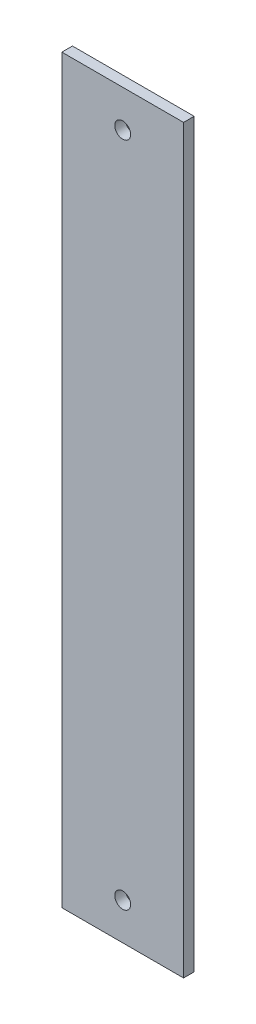
ISO-10303-21;
HEADER;
FILE_DESCRIPTION(('STEP AP214'),'2;1');
FILE_NAME('part.step','',(''),(''),'','','');
FILE_SCHEMA(('AUTOMOTIVE_DESIGN { 1 0 10303 214 1 1 1 1 }'));
ENDSEC;
DATA;
#1=APPLICATION_CONTEXT('core data for automotive mechanical design processes');
#2=APPLICATION_PROTOCOL_DEFINITION('international standard','automotive_design',2000,#1);
#3=PRODUCT_CONTEXT('',#1,'mechanical');
#4=PRODUCT('Part','Part','',(#3));
#5=PRODUCT_RELATED_PRODUCT_CATEGORY('part','',(#4));
#6=PRODUCT_DEFINITION_FORMATION('','',#4);
#7=PRODUCT_DEFINITION_CONTEXT('part definition',#1,'design');
#8=PRODUCT_DEFINITION('design','',#6,#7);
#9=PRODUCT_DEFINITION_SHAPE('','',#8);
#10=(LENGTH_UNIT() NAMED_UNIT(*) SI_UNIT(.MILLI.,.METRE.));
#11=(NAMED_UNIT(*) PLANE_ANGLE_UNIT() SI_UNIT($,.RADIAN.));
#12=(NAMED_UNIT(*) SI_UNIT($,.STERADIAN.) SOLID_ANGLE_UNIT());
#13=UNCERTAINTY_MEASURE_WITH_UNIT(LENGTH_MEASURE(1.E-05),#10,'distance_accuracy_value','');
#14=(GEOMETRIC_REPRESENTATION_CONTEXT(3) GLOBAL_UNCERTAINTY_ASSIGNED_CONTEXT((#13)) GLOBAL_UNIT_ASSIGNED_CONTEXT((#10,
#11,#12)) REPRESENTATION_CONTEXT('',''));
#15=CARTESIAN_POINT('',(0.,0.,0.));
#16=DIRECTION('',(0.,0.,1.));
#17=DIRECTION('',(1.,0.,0.));
#18=AXIS2_PLACEMENT_3D('',#15,#16,#17);
#19=CARTESIAN_POINT('',(0.,0.,2.));
#20=DIRECTION('',(0.,0.,-1.));
#21=DIRECTION('',(-1.,0.,0.));
#22=AXIS2_PLACEMENT_3D('',#19,#20,#21);
#23=PLANE('',#22);
#24=DIRECTION('',(0.,-1.,0.));
#25=VECTOR('',#24,1.);
#26=CARTESIAN_POINT('',(0.,0.,2.));
#27=LINE('',#26,#25);
#28=CARTESIAN_POINT('',(0.,140.,2.));
#29=VERTEX_POINT('',#28);
#30=CARTESIAN_POINT('',(0.,0.,2.));
#31=VERTEX_POINT('',#30);
#32=EDGE_CURVE('E85',#29,#31,#27,.T.);
#33=ORIENTED_EDGE('',*,*,#32,.T.);
#34=DIRECTION('',(1.,0.,0.));
#35=VECTOR('',#34,1.);
#36=CARTESIAN_POINT('',(0.,0.,2.));
#37=LINE('',#36,#35);
#38=CARTESIAN_POINT('',(23.,0.,2.));
#39=VERTEX_POINT('',#38);
#40=EDGE_CURVE('E80',#31,#39,#37,.T.);
#41=ORIENTED_EDGE('',*,*,#40,.T.);
#42=DIRECTION('',(0.,1.,0.));
#43=VECTOR('',#42,1.);
#44=CARTESIAN_POINT('',(23.,0.,2.));
#45=LINE('',#44,#43);
#46=CARTESIAN_POINT('',(23.,140.,2.));
#47=VERTEX_POINT('',#46);
#48=EDGE_CURVE('E83',#39,#47,#45,.T.);
#49=ORIENTED_EDGE('',*,*,#48,.T.);
#50=DIRECTION('',(-1.,0.,0.));
#51=VECTOR('',#50,1.);
#52=CARTESIAN_POINT('',(0.,140.,2.));
#53=LINE('',#52,#51);
#54=EDGE_CURVE('E50',#47,#29,#53,.T.);
#55=ORIENTED_EDGE('',*,*,#54,.T.);
#56=EDGE_LOOP('',(#33,#41,#49,#55));
#57=FACE_BOUND('',#56,.T.);
#58=CARTESIAN_POINT('',(11.5,133.,2.));
#59=DIRECTION('',(0.,0.,1.));
#60=DIRECTION('',(1.,0.,0.));
#61=AXIS2_PLACEMENT_3D('',#58,#59,#60);
#62=CIRCLE('',#61,1.5);
#63=CARTESIAN_POINT('',(13.,133.,2.));
#64=VERTEX_POINT('',#63);
#65=EDGE_CURVE('E100',#64,#64,#62,.T.);
#66=ORIENTED_EDGE('',*,*,#65,.F.);
#67=EDGE_LOOP('',(#66));
#68=FACE_BOUND('',#67,.T.);
#69=CARTESIAN_POINT('',(11.5,7.,2.));
#70=DIRECTION('',(0.,0.,1.));
#71=DIRECTION('',(1.,0.,0.));
#72=AXIS2_PLACEMENT_3D('',#69,#70,#71);
#73=CIRCLE('',#72,1.5);
#74=CARTESIAN_POINT('',(13.,7.,2.));
#75=VERTEX_POINT('',#74);
#76=EDGE_CURVE('E115',#75,#75,#73,.T.);
#77=ORIENTED_EDGE('',*,*,#76,.F.);
#78=EDGE_LOOP('',(#77));
#79=FACE_BOUND('',#78,.T.);
#80=ADVANCED_FACE('F33',(#57,#68,#79),#23,.F.);
#81=CARTESIAN_POINT('',(0.,0.,0.));
#82=DIRECTION('',(0.,0.,-1.));
#83=DIRECTION('',(-1.,0.,0.));
#84=AXIS2_PLACEMENT_3D('',#81,#82,#83);
#85=PLANE('',#84);
#86=CARTESIAN_POINT('',(11.5,133.,0.));
#87=DIRECTION('',(0.,0.,1.));
#88=DIRECTION('',(1.,0.,0.));
#89=AXIS2_PLACEMENT_3D('',#86,#87,#88);
#90=CIRCLE('',#89,1.5);
#91=CARTESIAN_POINT('',(13.,133.,0.));
#92=VERTEX_POINT('',#91);
#93=EDGE_CURVE('E112',#92,#92,#90,.T.);
#94=ORIENTED_EDGE('',*,*,#93,.T.);
#95=EDGE_LOOP('',(#94));
#96=FACE_BOUND('',#95,.T.);
#97=DIRECTION('',(0.,-1.,0.));
#98=VECTOR('',#97,1.);
#99=CARTESIAN_POINT('',(0.,0.,0.));
#100=LINE('',#99,#98);
#101=CARTESIAN_POINT('',(0.,140.,0.));
#102=VERTEX_POINT('',#101);
#103=CARTESIAN_POINT('',(0.,0.,0.));
#104=VERTEX_POINT('',#103);
#105=EDGE_CURVE('E97',#102,#104,#100,.T.);
#106=ORIENTED_EDGE('',*,*,#105,.F.);
#107=DIRECTION('',(-1.,0.,0.));
#108=VECTOR('',#107,1.);
#109=CARTESIAN_POINT('',(0.,140.,0.));
#110=LINE('',#109,#108);
#111=CARTESIAN_POINT('',(23.,140.,0.));
#112=VERTEX_POINT('',#111);
#113=EDGE_CURVE('E73',#112,#102,#110,.T.);
#114=ORIENTED_EDGE('',*,*,#113,.F.);
#115=DIRECTION('',(0.,1.,0.));
#116=VECTOR('',#115,1.);
#117=CARTESIAN_POINT('',(23.,0.,0.));
#118=LINE('',#117,#116);
#119=CARTESIAN_POINT('',(23.,0.,0.));
#120=VERTEX_POINT('',#119);
#121=EDGE_CURVE('E67',#120,#112,#118,.T.);
#122=ORIENTED_EDGE('',*,*,#121,.F.);
#123=DIRECTION('',(1.,0.,0.));
#124=VECTOR('',#123,1.);
#125=CARTESIAN_POINT('',(0.,0.,0.));
#126=LINE('',#125,#124);
#127=EDGE_CURVE('E89',#104,#120,#126,.T.);
#128=ORIENTED_EDGE('',*,*,#127,.F.);
#129=EDGE_LOOP('',(#106,#114,#122,#128));
#130=FACE_BOUND('',#129,.T.);
#131=CARTESIAN_POINT('',(11.5,7.,0.));
#132=DIRECTION('',(0.,0.,1.));
#133=DIRECTION('',(1.,0.,0.));
#134=AXIS2_PLACEMENT_3D('',#131,#132,#133);
#135=CIRCLE('',#134,1.5);
#136=CARTESIAN_POINT('',(13.,7.,0.));
#137=VERTEX_POINT('',#136);
#138=EDGE_CURVE('E118',#137,#137,#135,.T.);
#139=ORIENTED_EDGE('',*,*,#138,.T.);
#140=EDGE_LOOP('',(#139));
#141=FACE_BOUND('',#140,.T.);
#142=ADVANCED_FACE('F108',(#96,#130,#141),#85,.T.);
#143=CARTESIAN_POINT('',(0.,0.,2.));
#144=DIRECTION('',(1.,0.,0.));
#145=DIRECTION('',(0.,0.,-1.));
#146=AXIS2_PLACEMENT_3D('',#143,#144,#145);
#147=PLANE('',#146);
#148=ORIENTED_EDGE('',*,*,#105,.T.);
#149=DIRECTION('',(0.,0.,-1.));
#150=VECTOR('',#149,1.);
#151=CARTESIAN_POINT('',(0.,0.,2.));
#152=LINE('',#151,#150);
#153=EDGE_CURVE('E11',#31,#104,#152,.T.);
#154=ORIENTED_EDGE('',*,*,#153,.F.);
#155=ORIENTED_EDGE('',*,*,#32,.F.);
#156=DIRECTION('',(0.,0.,-1.));
#157=VECTOR('',#156,1.);
#158=CARTESIAN_POINT('',(0.,140.,2.));
#159=LINE('',#158,#157);
#160=EDGE_CURVE('E93',#29,#102,#159,.T.);
#161=ORIENTED_EDGE('',*,*,#160,.T.);
#162=EDGE_LOOP('',(#148,#154,#155,#161));
#163=FACE_BOUND('',#162,.T.);
#164=ADVANCED_FACE('F35',(#163),#147,.F.);
#165=CARTESIAN_POINT('',(0.,0.,2.));
#166=DIRECTION('',(0.,1.,0.));
#167=DIRECTION('',(0.,0.,1.));
#168=AXIS2_PLACEMENT_3D('',#165,#166,#167);
#169=PLANE('',#168);
#170=ORIENTED_EDGE('',*,*,#127,.T.);
#171=DIRECTION('',(0.,0.,-1.));
#172=VECTOR('',#171,1.);
#173=CARTESIAN_POINT('',(23.,0.,2.));
#174=LINE('',#173,#172);
#175=EDGE_CURVE('E42',#39,#120,#174,.T.);
#176=ORIENTED_EDGE('',*,*,#175,.F.);
#177=ORIENTED_EDGE('',*,*,#40,.F.);
#178=ORIENTED_EDGE('',*,*,#153,.T.);
#179=EDGE_LOOP('',(#170,#176,#177,#178));
#180=FACE_BOUND('',#179,.T.);
#181=ADVANCED_FACE('F88',(#180),#169,.F.);
#182=CARTESIAN_POINT('',(23.,0.,2.));
#183=DIRECTION('',(-1.,0.,0.));
#184=DIRECTION('',(0.,-1.,0.));
#185=AXIS2_PLACEMENT_3D('',#182,#183,#184);
#186=PLANE('',#185);
#187=ORIENTED_EDGE('',*,*,#121,.T.);
#188=DIRECTION('',(0.,0.,-1.));
#189=VECTOR('',#188,1.);
#190=CARTESIAN_POINT('',(23.,140.,2.));
#191=LINE('',#190,#189);
#192=EDGE_CURVE('E90',#47,#112,#191,.T.);
#193=ORIENTED_EDGE('',*,*,#192,.F.);
#194=ORIENTED_EDGE('',*,*,#48,.F.);
#195=ORIENTED_EDGE('',*,*,#175,.T.);
#196=EDGE_LOOP('',(#187,#193,#194,#195));
#197=FACE_BOUND('',#196,.T.);
#198=ADVANCED_FACE('F91',(#197),#186,.F.);
#199=CARTESIAN_POINT('',(0.,140.,2.));
#200=DIRECTION('',(0.,-1.,0.));
#201=DIRECTION('',(0.,0.,-1.));
#202=AXIS2_PLACEMENT_3D('',#199,#200,#201);
#203=PLANE('',#202);
#204=ORIENTED_EDGE('',*,*,#113,.T.);
#205=ORIENTED_EDGE('',*,*,#160,.F.);
#206=ORIENTED_EDGE('',*,*,#54,.F.);
#207=ORIENTED_EDGE('',*,*,#192,.T.);
#208=EDGE_LOOP('',(#204,#205,#206,#207));
#209=FACE_BOUND('',#208,.T.);
#210=ADVANCED_FACE('F105',(#209),#203,.F.);
#211=CARTESIAN_POINT('',(11.5,133.,2.));
#212=DIRECTION('',(0.,0.,-1.));
#213=DIRECTION('',(-1.,0.,0.));
#214=AXIS2_PLACEMENT_3D('',#211,#212,#213);
#215=CYLINDRICAL_SURFACE('',#214,1.5);
#216=ORIENTED_EDGE('',*,*,#65,.T.);
#217=EDGE_LOOP('',(#216));
#218=FACE_BOUND('',#217,.T.);
#219=ORIENTED_EDGE('',*,*,#93,.F.);
#220=EDGE_LOOP('',(#219));
#221=FACE_BOUND('',#220,.T.);
#222=ADVANCED_FACE('F135',(#218,#221),#215,.F.);
#223=CARTESIAN_POINT('',(11.5,7.,2.));
#224=DIRECTION('',(0.,0.,-1.));
#225=DIRECTION('',(-1.,0.,0.));
#226=AXIS2_PLACEMENT_3D('',#223,#224,#225);
#227=CYLINDRICAL_SURFACE('',#226,1.5);
#228=ORIENTED_EDGE('',*,*,#76,.T.);
#229=EDGE_LOOP('',(#228));
#230=FACE_BOUND('',#229,.T.);
#231=ORIENTED_EDGE('',*,*,#138,.F.);
#232=EDGE_LOOP('',(#231));
#233=FACE_BOUND('',#232,.T.);
#234=ADVANCED_FACE('F124',(#230,#233),#227,.F.);
#235=CLOSED_SHELL('',(#80,#142,#164,#181,#198,#210,#222,#234));
#236=MANIFOLD_SOLID_BREP('B2',#235);
#237=ADVANCED_BREP_SHAPE_REPRESENTATION('',(#18,#236),#14);
#238=SHAPE_DEFINITION_REPRESENTATION(#9,#237);
ENDSEC;
END-ISO-10303-21;
